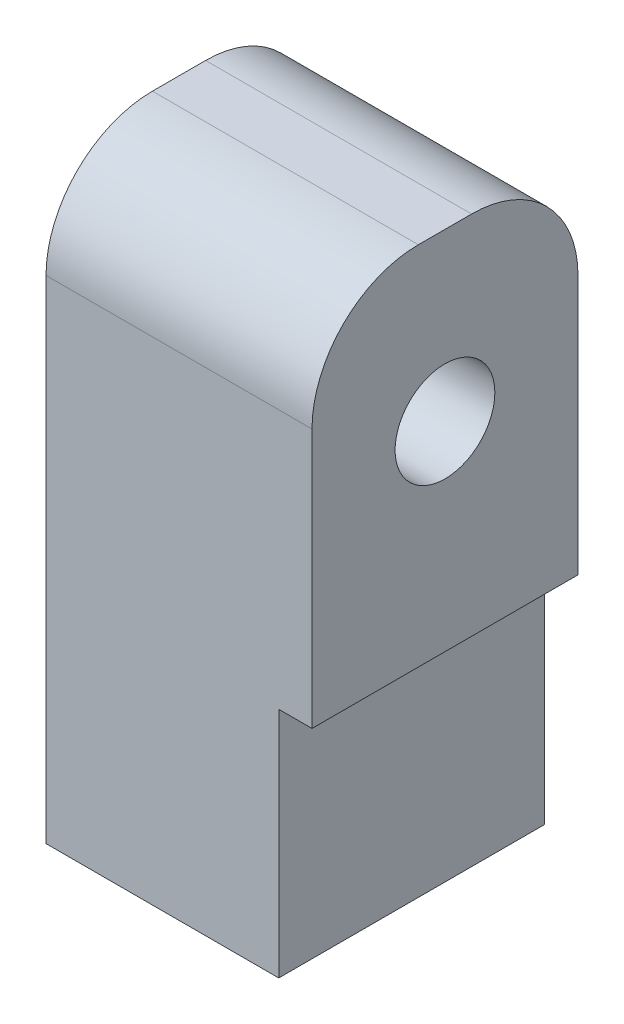
ISO-10303-21;
HEADER;
FILE_DESCRIPTION(('STEP AP214'),'2;1');
FILE_NAME('part.step','',(''),(''),'','','');
FILE_SCHEMA(('AUTOMOTIVE_DESIGN { 1 0 10303 214 1 1 1 1 }'));
ENDSEC;
DATA;
#1=APPLICATION_CONTEXT('core data for automotive mechanical design processes');
#2=APPLICATION_PROTOCOL_DEFINITION('international standard','automotive_design',2000,#1);
#3=PRODUCT_CONTEXT('',#1,'mechanical');
#4=PRODUCT('Part','Part','',(#3));
#5=PRODUCT_RELATED_PRODUCT_CATEGORY('part','',(#4));
#6=PRODUCT_DEFINITION_FORMATION('','',#4);
#7=PRODUCT_DEFINITION_CONTEXT('part definition',#1,'design');
#8=PRODUCT_DEFINITION('design','',#6,#7);
#9=PRODUCT_DEFINITION_SHAPE('','',#8);
#10=(LENGTH_UNIT() NAMED_UNIT(*) SI_UNIT(.MILLI.,.METRE.));
#11=(NAMED_UNIT(*) PLANE_ANGLE_UNIT() SI_UNIT($,.RADIAN.));
#12=(NAMED_UNIT(*) SI_UNIT($,.STERADIAN.) SOLID_ANGLE_UNIT());
#13=UNCERTAINTY_MEASURE_WITH_UNIT(LENGTH_MEASURE(1.E-05),#10,'distance_accuracy_value','');
#14=(GEOMETRIC_REPRESENTATION_CONTEXT(3) GLOBAL_UNCERTAINTY_ASSIGNED_CONTEXT((#13)) GLOBAL_UNIT_ASSIGNED_CONTEXT((#10,
#11,#12)) REPRESENTATION_CONTEXT('',''));
#15=CARTESIAN_POINT('',(0.,0.,0.));
#16=DIRECTION('',(0.,0.,1.));
#17=DIRECTION('',(1.,0.,0.));
#18=AXIS2_PLACEMENT_3D('',#15,#16,#17);
#19=CARTESIAN_POINT('',(-0.4375,1.625,0.));
#20=DIRECTION('',(1.,0.,0.));
#21=DIRECTION('',(0.,0.,-1.));
#22=AXIS2_PLACEMENT_3D('',#19,#20,#21);
#23=CYLINDRICAL_SURFACE('',#22,0.1875);
#24=CARTESIAN_POINT('',(0.5625,1.625,0.));
#25=DIRECTION('',(1.,0.,0.));
#26=DIRECTION('',(0.,0.,-1.));
#27=AXIS2_PLACEMENT_3D('',#24,#25,#26);
#28=CIRCLE('',#27,0.1875);
#29=CARTESIAN_POINT('',(0.5625,1.625,-0.1875));
#30=VERTEX_POINT('',#29);
#31=EDGE_CURVE('E124',#30,#30,#28,.T.);
#32=ORIENTED_EDGE('',*,*,#31,.T.);
#33=EDGE_LOOP('',(#32));
#34=FACE_BOUND('',#33,.T.);
#35=CARTESIAN_POINT('',(-0.3125,1.625,0.));
#36=DIRECTION('',(-1.,0.,0.));
#37=DIRECTION('',(0.,0.,1.));
#38=AXIS2_PLACEMENT_3D('',#35,#36,#37);
#39=CIRCLE('',#38,0.1875);
#40=CARTESIAN_POINT('',(-0.3125,1.625,0.1875));
#41=VERTEX_POINT('',#40);
#42=EDGE_CURVE('E169',#41,#41,#39,.F.);
#43=ORIENTED_EDGE('',*,*,#42,.F.);
#44=EDGE_LOOP('',(#43));
#45=FACE_BOUND('',#44,.T.);
#46=ADVANCED_FACE('F39',(#34,#45),#23,.F.);
#47=CARTESIAN_POINT('',(0.4375,0.875,-0.5));
#48=DIRECTION('',(-1.,0.,0.));
#49=DIRECTION('',(0.,0.,1.));
#50=AXIS2_PLACEMENT_3D('',#47,#48,#49);
#51=PLANE('',#50);
#52=DIRECTION('',(0.,0.,-1.));
#53=VECTOR('',#52,1.);
#54=CARTESIAN_POINT('',(0.4375,0.,-0.5));
#55=LINE('',#54,#53);
#56=CARTESIAN_POINT('',(0.4375,0.,0.5));
#57=VERTEX_POINT('',#56);
#58=CARTESIAN_POINT('',(0.4375,0.,-0.5));
#59=VERTEX_POINT('',#58);
#60=EDGE_CURVE('E112',#57,#59,#55,.T.);
#61=ORIENTED_EDGE('',*,*,#60,.T.);
#62=DIRECTION('',(0.,-1.,0.));
#63=VECTOR('',#62,1.);
#64=CARTESIAN_POINT('',(0.4375,0.875,-0.5));
#65=LINE('',#64,#63);
#66=CARTESIAN_POINT('',(0.4375,0.875,-0.5));
#67=VERTEX_POINT('',#66);
#68=EDGE_CURVE('E164',#67,#59,#65,.T.);
#69=ORIENTED_EDGE('',*,*,#68,.F.);
#70=DIRECTION('',(0.,0.,-1.));
#71=VECTOR('',#70,1.);
#72=CARTESIAN_POINT('',(0.4375,0.875,-0.5));
#73=LINE('',#72,#71);
#74=CARTESIAN_POINT('',(0.4375,0.875,0.5));
#75=VERTEX_POINT('',#74);
#76=EDGE_CURVE('E139',#75,#67,#73,.T.);
#77=ORIENTED_EDGE('',*,*,#76,.F.);
#78=DIRECTION('',(0.,-1.,0.));
#79=VECTOR('',#78,1.);
#80=CARTESIAN_POINT('',(0.4375,0.875,0.5));
#81=LINE('',#80,#79);
#82=EDGE_CURVE('E119',#75,#57,#81,.T.);
#83=ORIENTED_EDGE('',*,*,#82,.T.);
#84=EDGE_LOOP('',(#61,#69,#77,#83));
#85=FACE_BOUND('',#84,.T.);
#86=ADVANCED_FACE('F219',(#85),#51,.F.);
#87=CARTESIAN_POINT('',(-0.4375,0.875,-0.5));
#88=DIRECTION('',(0.,0.,1.));
#89=DIRECTION('',(1.,0.,0.));
#90=AXIS2_PLACEMENT_3D('',#87,#88,#89);
#91=PLANE('',#90);
#92=DIRECTION('',(0.,-1.,0.));
#93=VECTOR('',#92,1.);
#94=CARTESIAN_POINT('',(-0.4375,0.875,-0.5));
#95=LINE('',#94,#93);
#96=CARTESIAN_POINT('',(-0.4375,1.85,-0.5));
#97=VERTEX_POINT('',#96);
#98=CARTESIAN_POINT('',(-0.4375,0.,-0.5));
#99=VERTEX_POINT('',#98);
#100=EDGE_CURVE('E161',#97,#99,#95,.T.);
#101=ORIENTED_EDGE('',*,*,#100,.F.);
#102=DIRECTION('',(-1.,0.,0.));
#103=VECTOR('',#102,1.);
#104=CARTESIAN_POINT('',(0.5625,1.85,-0.5));
#105=LINE('',#104,#103);
#106=CARTESIAN_POINT('',(0.5625,1.85,-0.5));
#107=VERTEX_POINT('',#106);
#108=EDGE_CURVE('E63',#97,#107,#105,.F.);
#109=ORIENTED_EDGE('',*,*,#108,.T.);
#110=DIRECTION('',(0.,-1.,0.));
#111=VECTOR('',#110,1.);
#112=CARTESIAN_POINT('',(0.5625,2.25,-0.5));
#113=LINE('',#112,#111);
#114=CARTESIAN_POINT('',(0.5625,0.875,-0.5));
#115=VERTEX_POINT('',#114);
#116=EDGE_CURVE('E113',#107,#115,#113,.T.);
#117=ORIENTED_EDGE('',*,*,#116,.T.);
#118=DIRECTION('',(-1.,0.,0.));
#119=VECTOR('',#118,1.);
#120=CARTESIAN_POINT('',(0.5625,0.875,-0.5));
#121=LINE('',#120,#119);
#122=EDGE_CURVE('E128',#115,#67,#121,.T.);
#123=ORIENTED_EDGE('',*,*,#122,.T.);
#124=ORIENTED_EDGE('',*,*,#68,.T.);
#125=DIRECTION('',(-1.,0.,0.));
#126=VECTOR('',#125,1.);
#127=CARTESIAN_POINT('',(-0.4375,0.,-0.5));
#128=LINE('',#127,#126);
#129=EDGE_CURVE('E146',#59,#99,#128,.T.);
#130=ORIENTED_EDGE('',*,*,#129,.T.);
#131=EDGE_LOOP('',(#101,#109,#117,#123,#124,#130));
#132=FACE_BOUND('',#131,.T.);
#133=ADVANCED_FACE('F204',(#132),#91,.F.);
#134=CARTESIAN_POINT('',(-0.4375,0.875,-0.5));
#135=DIRECTION('',(1.,0.,0.));
#136=DIRECTION('',(0.,0.,-1.));
#137=AXIS2_PLACEMENT_3D('',#134,#135,#136);
#138=PLANE('',#137);
#139=CARTESIAN_POINT('',(-0.4375,1.625,0.));
#140=DIRECTION('',(-1.,0.,0.));
#141=DIRECTION('',(0.,0.,1.));
#142=AXIS2_PLACEMENT_3D('',#139,#140,#141);
#143=CIRCLE('',#142,0.2375);
#144=CARTESIAN_POINT('',(-0.4375,1.625,0.2375));
#145=VERTEX_POINT('',#144);
#146=EDGE_CURVE('E360',#145,#145,#143,.T.);
#147=ORIENTED_EDGE('',*,*,#146,.F.);
#148=EDGE_LOOP('',(#147));
#149=FACE_BOUND('',#148,.T.);
#150=DIRECTION('',(0.,0.,1.));
#151=VECTOR('',#150,1.);
#152=CARTESIAN_POINT('',(-0.4375,2.25,-0.5));
#153=LINE('',#152,#151);
#154=CARTESIAN_POINT('',(-0.4375,2.25,-0.1));
#155=VERTEX_POINT('',#154);
#156=CARTESIAN_POINT('',(-0.4375,2.25,0.1));
#157=VERTEX_POINT('',#156);
#158=EDGE_CURVE('E132',#155,#157,#153,.T.);
#159=ORIENTED_EDGE('',*,*,#158,.F.);
#160=CARTESIAN_POINT('',(-0.4375,1.85,-0.1));
#161=DIRECTION('',(1.,0.,0.));
#162=DIRECTION('',(0.,0.,-1.));
#163=AXIS2_PLACEMENT_3D('',#160,#161,#162);
#164=CIRCLE('',#163,0.4);
#165=EDGE_CURVE('E184',#155,#97,#164,.F.);
#166=ORIENTED_EDGE('',*,*,#165,.T.);
#167=ORIENTED_EDGE('',*,*,#100,.T.);
#168=DIRECTION('',(0.,0.,1.));
#169=VECTOR('',#168,1.);
#170=CARTESIAN_POINT('',(-0.4375,0.,-0.5));
#171=LINE('',#170,#169);
#172=CARTESIAN_POINT('',(-0.4375,0.,0.5));
#173=VERTEX_POINT('',#172);
#174=EDGE_CURVE('E150',#99,#173,#171,.T.);
#175=ORIENTED_EDGE('',*,*,#174,.T.);
#176=DIRECTION('',(0.,-1.,0.));
#177=VECTOR('',#176,1.);
#178=CARTESIAN_POINT('',(-0.4375,0.875,0.5));
#179=LINE('',#178,#177);
#180=CARTESIAN_POINT('',(-0.4375,1.85,0.5));
#181=VERTEX_POINT('',#180);
#182=EDGE_CURVE('E158',#181,#173,#179,.T.);
#183=ORIENTED_EDGE('',*,*,#182,.F.);
#184=CARTESIAN_POINT('',(-0.4375,1.85,0.1));
#185=DIRECTION('',(1.,0.,0.));
#186=DIRECTION('',(0.,0.,-1.));
#187=AXIS2_PLACEMENT_3D('',#184,#185,#186);
#188=CIRCLE('',#187,0.4);
#189=EDGE_CURVE('E181',#181,#157,#188,.F.);
#190=ORIENTED_EDGE('',*,*,#189,.T.);
#191=EDGE_LOOP('',(#159,#166,#167,#175,#183,#190));
#192=FACE_BOUND('',#191,.T.);
#193=ADVANCED_FACE('F203',(#149,#192),#138,.F.);
#194=CARTESIAN_POINT('',(-0.4375,0.875,0.5));
#195=DIRECTION('',(0.,0.,-1.));
#196=DIRECTION('',(-1.,0.,0.));
#197=AXIS2_PLACEMENT_3D('',#194,#195,#196);
#198=PLANE('',#197);
#199=DIRECTION('',(0.,-1.,0.));
#200=VECTOR('',#199,1.);
#201=CARTESIAN_POINT('',(0.5625,2.25,0.5));
#202=LINE('',#201,#200);
#203=CARTESIAN_POINT('',(0.5625,1.85,0.5));
#204=VERTEX_POINT('',#203);
#205=CARTESIAN_POINT('',(0.5625,0.875,0.5));
#206=VERTEX_POINT('',#205);
#207=EDGE_CURVE('E103',#204,#206,#202,.T.);
#208=ORIENTED_EDGE('',*,*,#207,.F.);
#209=DIRECTION('',(1.,0.,0.));
#210=VECTOR('',#209,1.);
#211=CARTESIAN_POINT('',(-0.4375,1.85,0.5));
#212=LINE('',#211,#210);
#213=EDGE_CURVE('E11',#204,#181,#212,.F.);
#214=ORIENTED_EDGE('',*,*,#213,.T.);
#215=ORIENTED_EDGE('',*,*,#182,.T.);
#216=DIRECTION('',(1.,0.,0.));
#217=VECTOR('',#216,1.);
#218=CARTESIAN_POINT('',(-0.4375,0.,0.5));
#219=LINE('',#218,#217);
#220=EDGE_CURVE('E142',#173,#57,#219,.T.);
#221=ORIENTED_EDGE('',*,*,#220,.T.);
#222=ORIENTED_EDGE('',*,*,#82,.F.);
#223=DIRECTION('',(1.,0.,0.));
#224=VECTOR('',#223,1.);
#225=CARTESIAN_POINT('',(-0.4375,0.875,0.5));
#226=LINE('',#225,#224);
#227=EDGE_CURVE('E116',#75,#206,#226,.T.);
#228=ORIENTED_EDGE('',*,*,#227,.T.);
#229=EDGE_LOOP('',(#208,#214,#215,#221,#222,#228));
#230=FACE_BOUND('',#229,.T.);
#231=ADVANCED_FACE('F117',(#230),#198,.F.);
#232=CARTESIAN_POINT('',(0.,0.,0.));
#233=DIRECTION('',(0.,1.,0.));
#234=DIRECTION('',(0.,0.,1.));
#235=AXIS2_PLACEMENT_3D('',#232,#233,#234);
#236=PLANE('',#235);
#237=CARTESIAN_POINT('',(0.0624999999999999,0.,0.));
#238=DIRECTION('',(0.,-1.,0.));
#239=DIRECTION('',(0.,0.,-1.));
#240=AXIS2_PLACEMENT_3D('',#237,#238,#239);
#241=CIRCLE('',#240,0.25);
#242=CARTESIAN_POINT('',(0.0624999999999999,0.,-0.25));
#243=VERTEX_POINT('',#242);
#244=EDGE_CURVE('E361',#243,#243,#241,.T.);
#245=ORIENTED_EDGE('',*,*,#244,.F.);
#246=EDGE_LOOP('',(#245));
#247=FACE_BOUND('',#246,.T.);
#248=ORIENTED_EDGE('',*,*,#60,.F.);
#249=ORIENTED_EDGE('',*,*,#220,.F.);
#250=ORIENTED_EDGE('',*,*,#174,.F.);
#251=ORIENTED_EDGE('',*,*,#129,.F.);
#252=EDGE_LOOP('',(#248,#249,#250,#251));
#253=FACE_BOUND('',#252,.T.);
#254=ADVANCED_FACE('F209',(#247,#253),#236,.F.);
#255=CARTESIAN_POINT('',(0.,0.875,0.));
#256=DIRECTION('',(0.,1.,0.));
#257=DIRECTION('',(0.,0.,1.));
#258=AXIS2_PLACEMENT_3D('',#255,#256,#257);
#259=PLANE('',#258);
#260=ORIENTED_EDGE('',*,*,#227,.F.);
#261=ORIENTED_EDGE('',*,*,#76,.T.);
#262=ORIENTED_EDGE('',*,*,#122,.F.);
#263=DIRECTION('',(0.,0.,-1.));
#264=VECTOR('',#263,1.);
#265=CARTESIAN_POINT('',(0.5625,0.875,0.5));
#266=LINE('',#265,#264);
#267=EDGE_CURVE('E107',#206,#115,#266,.T.);
#268=ORIENTED_EDGE('',*,*,#267,.F.);
#269=EDGE_LOOP('',(#260,#261,#262,#268));
#270=FACE_BOUND('',#269,.T.);
#271=ADVANCED_FACE('F126',(#270),#259,.F.);
#272=CARTESIAN_POINT('',(0.5625,2.25,0.5));
#273=DIRECTION('',(-1.,0.,0.));
#274=DIRECTION('',(0.,0.,1.));
#275=AXIS2_PLACEMENT_3D('',#272,#273,#274);
#276=PLANE('',#275);
#277=ORIENTED_EDGE('',*,*,#31,.F.);
#278=EDGE_LOOP('',(#277));
#279=FACE_BOUND('',#278,.T.);
#280=ORIENTED_EDGE('',*,*,#116,.F.);
#281=CARTESIAN_POINT('',(0.5625,1.85,-0.1));
#282=DIRECTION('',(-1.,0.,0.));
#283=DIRECTION('',(0.,0.,1.));
#284=AXIS2_PLACEMENT_3D('',#281,#282,#283);
#285=CIRCLE('',#284,0.4);
#286=CARTESIAN_POINT('',(0.5625,2.25,-0.1));
#287=VERTEX_POINT('',#286);
#288=EDGE_CURVE('E48',#107,#287,#285,.F.);
#289=ORIENTED_EDGE('',*,*,#288,.T.);
#290=DIRECTION('',(0.,0.,-1.));
#291=VECTOR('',#290,1.);
#292=CARTESIAN_POINT('',(0.5625,2.25,0.5));
#293=LINE('',#292,#291);
#294=CARTESIAN_POINT('',(0.5625,2.25,0.1));
#295=VERTEX_POINT('',#294);
#296=EDGE_CURVE('E137',#295,#287,#293,.T.);
#297=ORIENTED_EDGE('',*,*,#296,.F.);
#298=CARTESIAN_POINT('',(0.5625,1.85,0.1));
#299=DIRECTION('',(-1.,0.,0.));
#300=DIRECTION('',(0.,0.,1.));
#301=AXIS2_PLACEMENT_3D('',#298,#299,#300);
#302=CIRCLE('',#301,0.4);
#303=EDGE_CURVE('E55',#295,#204,#302,.F.);
#304=ORIENTED_EDGE('',*,*,#303,.T.);
#305=ORIENTED_EDGE('',*,*,#207,.T.);
#306=ORIENTED_EDGE('',*,*,#267,.T.);
#307=EDGE_LOOP('',(#280,#289,#297,#304,#305,#306));
#308=FACE_BOUND('',#307,.T.);
#309=ADVANCED_FACE('F105',(#279,#308),#276,.F.);
#310=CARTESIAN_POINT('',(0.,2.25,0.));
#311=DIRECTION('',(0.,1.,0.));
#312=DIRECTION('',(0.,0.,1.));
#313=AXIS2_PLACEMENT_3D('',#310,#311,#312);
#314=PLANE('',#313);
#315=ORIENTED_EDGE('',*,*,#296,.T.);
#316=DIRECTION('',(-1.,0.,0.));
#317=VECTOR('',#316,1.);
#318=CARTESIAN_POINT('',(-0.4375,2.25,-0.1));
#319=LINE('',#318,#317);
#320=EDGE_CURVE('E177',#287,#155,#319,.T.);
#321=ORIENTED_EDGE('',*,*,#320,.T.);
#322=ORIENTED_EDGE('',*,*,#158,.T.);
#323=DIRECTION('',(1.,0.,0.));
#324=VECTOR('',#323,1.);
#325=CARTESIAN_POINT('',(0.5625,2.25,0.1));
#326=LINE('',#325,#324);
#327=EDGE_CURVE('E168',#157,#295,#326,.T.);
#328=ORIENTED_EDGE('',*,*,#327,.T.);
#329=EDGE_LOOP('',(#315,#321,#322,#328));
#330=FACE_BOUND('',#329,.T.);
#331=ADVANCED_FACE('F196',(#330),#314,.T.);
#332=CARTESIAN_POINT('',(-0.3125,1.625,0.));
#333=DIRECTION('',(-1.,0.,0.));
#334=DIRECTION('',(0.,0.,1.));
#335=AXIS2_PLACEMENT_3D('',#332,#333,#334);
#336=PLANE('',#335);
#337=CARTESIAN_POINT('',(-0.3125,1.625,0.));
#338=DIRECTION('',(-1.,0.,0.));
#339=DIRECTION('',(0.,0.,1.));
#340=AXIS2_PLACEMENT_3D('',#337,#338,#339);
#341=CIRCLE('',#340,0.2375);
#342=CARTESIAN_POINT('',(-0.3125,1.625,0.2375));
#343=VERTEX_POINT('',#342);
#344=EDGE_CURVE('E173',#343,#343,#341,.T.);
#345=ORIENTED_EDGE('',*,*,#344,.T.);
#346=EDGE_LOOP('',(#345));
#347=FACE_BOUND('',#346,.T.);
#348=ORIENTED_EDGE('',*,*,#42,.T.);
#349=EDGE_LOOP('',(#348));
#350=FACE_BOUND('',#349,.T.);
#351=ADVANCED_FACE('F235',(#347,#350),#336,.T.);
#352=CARTESIAN_POINT('',(-0.3125,1.625,0.));
#353=DIRECTION('',(-1.,0.,0.));
#354=DIRECTION('',(0.,0.,1.));
#355=AXIS2_PLACEMENT_3D('',#352,#353,#354);
#356=CYLINDRICAL_SURFACE('',#355,0.2375);
#357=ORIENTED_EDGE('',*,*,#344,.F.);
#358=EDGE_LOOP('',(#357));
#359=FACE_BOUND('',#358,.T.);
#360=ORIENTED_EDGE('',*,*,#146,.T.);
#361=EDGE_LOOP('',(#360));
#362=FACE_BOUND('',#361,.T.);
#363=ADVANCED_FACE('F231',(#359,#362),#356,.F.);
#364=CARTESIAN_POINT('',(0.0624999999999999,1.188,0.));
#365=DIRECTION('',(0.,-1.,0.));
#366=DIRECTION('',(0.,0.,-1.));
#367=AXIS2_PLACEMENT_3D('',#364,#365,#366);
#368=CYLINDRICAL_SURFACE('',#367,0.25);
#369=CARTESIAN_POINT('',(0.0624999999999999,1.188,0.));
#370=DIRECTION('',(0.,-1.,0.));
#371=DIRECTION('',(0.,0.,-1.));
#372=AXIS2_PLACEMENT_3D('',#369,#370,#371);
#373=CIRCLE('',#372,0.25);
#374=CARTESIAN_POINT('',(0.0624999999999999,1.188,-0.25));
#375=VERTEX_POINT('',#374);
#376=EDGE_CURVE('E358',#375,#375,#373,.T.);
#377=ORIENTED_EDGE('',*,*,#376,.F.);
#378=EDGE_LOOP('',(#377));
#379=FACE_BOUND('',#378,.T.);
#380=ORIENTED_EDGE('',*,*,#244,.T.);
#381=EDGE_LOOP('',(#380));
#382=FACE_BOUND('',#381,.T.);
#383=ADVANCED_FACE('F293',(#379,#382),#368,.F.);
#384=CARTESIAN_POINT('',(0.0624999999999999,1.188,0.));
#385=DIRECTION('',(0.,-1.,0.));
#386=DIRECTION('',(0.,0.,-1.));
#387=AXIS2_PLACEMENT_3D('',#384,#385,#386);
#388=PLANE('',#387);
#389=ORIENTED_EDGE('',*,*,#376,.T.);
#390=EDGE_LOOP('',(#389));
#391=FACE_BOUND('',#390,.T.);
#392=ADVANCED_FACE('F217',(#391),#388,.T.);
#393=CARTESIAN_POINT('',(0.,1.85,-0.1));
#394=DIRECTION('',(1.,0.,0.));
#395=DIRECTION('',(0.,0.,-1.));
#396=AXIS2_PLACEMENT_3D('',#393,#394,#395);
#397=CYLINDRICAL_SURFACE('',#396,0.4);
#398=ORIENTED_EDGE('',*,*,#288,.F.);
#399=ORIENTED_EDGE('',*,*,#108,.F.);
#400=ORIENTED_EDGE('',*,*,#165,.F.);
#401=ORIENTED_EDGE('',*,*,#320,.F.);
#402=EDGE_LOOP('',(#398,#399,#400,#401));
#403=FACE_BOUND('',#402,.T.);
#404=ADVANCED_FACE('F201',(#403),#397,.T.);
#405=CARTESIAN_POINT('',(0.,1.85,0.1));
#406=DIRECTION('',(-1.,0.,0.));
#407=DIRECTION('',(0.,0.,1.));
#408=AXIS2_PLACEMENT_3D('',#405,#406,#407);
#409=CYLINDRICAL_SURFACE('',#408,0.4);
#410=ORIENTED_EDGE('',*,*,#189,.F.);
#411=ORIENTED_EDGE('',*,*,#213,.F.);
#412=ORIENTED_EDGE('',*,*,#303,.F.);
#413=ORIENTED_EDGE('',*,*,#327,.F.);
#414=EDGE_LOOP('',(#410,#411,#412,#413));
#415=FACE_BOUND('',#414,.T.);
#416=ADVANCED_FACE('F41',(#415),#409,.T.);
#417=CLOSED_SHELL('',(#46,#86,#133,#193,#231,#254,#271,#309,#331,#351,#363,#383,#392,#404,#416));
#418=MANIFOLD_SOLID_BREP('B2',#417);
#419=ADVANCED_BREP_SHAPE_REPRESENTATION('',(#18,#418),#14);
#420=SHAPE_DEFINITION_REPRESENTATION(#9,#419);
ENDSEC;
END-ISO-10303-21;
